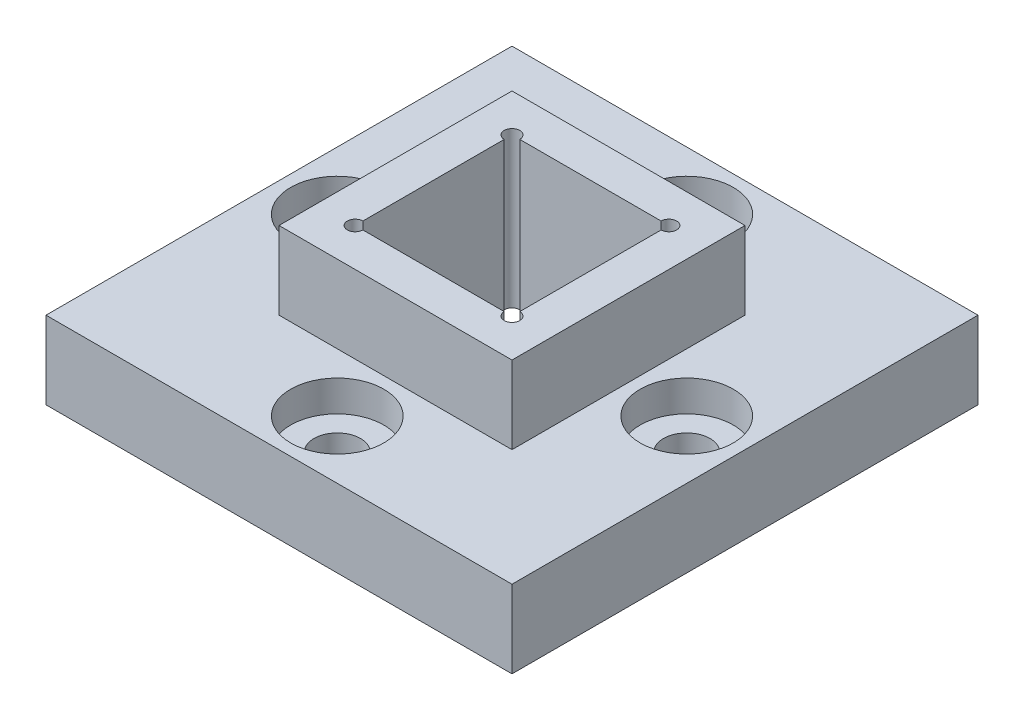
ISO-10303-21;
HEADER;
FILE_DESCRIPTION(('STEP AP214'),'2;1');
FILE_NAME('part.step','',(''),(''),'','','');
FILE_SCHEMA(('AUTOMOTIVE_DESIGN { 1 0 10303 214 1 1 1 1 }'));
ENDSEC;
DATA;
#1=APPLICATION_CONTEXT('core data for automotive mechanical design processes');
#2=APPLICATION_PROTOCOL_DEFINITION('international standard','automotive_design',2000,#1);
#3=PRODUCT_CONTEXT('',#1,'mechanical');
#4=PRODUCT('Part','Part','',(#3));
#5=PRODUCT_RELATED_PRODUCT_CATEGORY('part','',(#4));
#6=PRODUCT_DEFINITION_FORMATION('','',#4);
#7=PRODUCT_DEFINITION_CONTEXT('part definition',#1,'design');
#8=PRODUCT_DEFINITION('design','',#6,#7);
#9=PRODUCT_DEFINITION_SHAPE('','',#8);
#10=(LENGTH_UNIT() NAMED_UNIT(*) SI_UNIT(.MILLI.,.METRE.));
#11=(NAMED_UNIT(*) PLANE_ANGLE_UNIT() SI_UNIT($,.RADIAN.));
#12=(NAMED_UNIT(*) SI_UNIT($,.STERADIAN.) SOLID_ANGLE_UNIT());
#13=UNCERTAINTY_MEASURE_WITH_UNIT(LENGTH_MEASURE(1.E-05),#10,'distance_accuracy_value','');
#14=(GEOMETRIC_REPRESENTATION_CONTEXT(3) GLOBAL_UNCERTAINTY_ASSIGNED_CONTEXT((#13)) GLOBAL_UNIT_ASSIGNED_CONTEXT((#10,
#11,#12)) REPRESENTATION_CONTEXT('',''));
#15=CARTESIAN_POINT('',(0.,0.,0.));
#16=DIRECTION('',(0.,0.,1.));
#17=DIRECTION('',(1.,0.,0.));
#18=AXIS2_PLACEMENT_3D('',#15,#16,#17);
#19=CARTESIAN_POINT('',(11.25,0.,0.));
#20=DIRECTION('',(0.,1.,0.));
#21=DIRECTION('',(0.,0.,1.));
#22=AXIS2_PLACEMENT_3D('',#19,#20,#21);
#23=CYLINDRICAL_SURFACE('',#22,1.5);
#24=CARTESIAN_POINT('',(11.25,0.,0.));
#25=DIRECTION('',(0.,1.,0.));
#26=DIRECTION('',(0.,0.,1.));
#27=AXIS2_PLACEMENT_3D('',#24,#25,#26);
#28=CIRCLE('',#27,1.5);
#29=CARTESIAN_POINT('',(11.25,0.,1.5));
#30=VERTEX_POINT('',#29);
#31=EDGE_CURVE('E236',#30,#30,#28,.T.);
#32=ORIENTED_EDGE('',*,*,#31,.F.);
#33=EDGE_LOOP('',(#32));
#34=FACE_BOUND('',#33,.T.);
#35=CARTESIAN_POINT('',(11.25,3.,0.));
#36=DIRECTION('',(0.,1.,0.));
#37=DIRECTION('',(0.,0.,1.));
#38=AXIS2_PLACEMENT_3D('',#35,#36,#37);
#39=CIRCLE('',#38,1.5);
#40=CARTESIAN_POINT('',(11.25,3.,1.5));
#41=VERTEX_POINT('',#40);
#42=EDGE_CURVE('E93',#41,#41,#39,.F.);
#43=ORIENTED_EDGE('',*,*,#42,.F.);
#44=EDGE_LOOP('',(#43));
#45=FACE_BOUND('',#44,.T.);
#46=ADVANCED_FACE('F87',(#34,#45),#23,.F.);
#47=CARTESIAN_POINT('',(0.,0.,-11.25));
#48=DIRECTION('',(0.,1.,0.));
#49=DIRECTION('',(0.,0.,1.));
#50=AXIS2_PLACEMENT_3D('',#47,#48,#49);
#51=CYLINDRICAL_SURFACE('',#50,1.5);
#52=CARTESIAN_POINT('',(0.,0.,-11.25));
#53=DIRECTION('',(0.,1.,0.));
#54=DIRECTION('',(0.,0.,1.));
#55=AXIS2_PLACEMENT_3D('',#52,#53,#54);
#56=CIRCLE('',#55,1.5);
#57=CARTESIAN_POINT('',(0.,0.,-9.75));
#58=VERTEX_POINT('',#57);
#59=EDGE_CURVE('E241',#58,#58,#56,.T.);
#60=ORIENTED_EDGE('',*,*,#59,.F.);
#61=EDGE_LOOP('',(#60));
#62=FACE_BOUND('',#61,.T.);
#63=CARTESIAN_POINT('',(0.,3.,-11.25));
#64=DIRECTION('',(0.,1.,0.));
#65=DIRECTION('',(0.,0.,1.));
#66=AXIS2_PLACEMENT_3D('',#63,#64,#65);
#67=CIRCLE('',#66,1.5);
#68=CARTESIAN_POINT('',(0.,3.,-9.75));
#69=VERTEX_POINT('',#68);
#70=EDGE_CURVE('E336',#69,#69,#67,.F.);
#71=ORIENTED_EDGE('',*,*,#70,.F.);
#72=EDGE_LOOP('',(#71));
#73=FACE_BOUND('',#72,.T.);
#74=ADVANCED_FACE('F438',(#62,#73),#51,.F.);
#75=CARTESIAN_POINT('',(-11.25,0.,0.));
#76=DIRECTION('',(0.,1.,0.));
#77=DIRECTION('',(0.,0.,1.));
#78=AXIS2_PLACEMENT_3D('',#75,#76,#77);
#79=CYLINDRICAL_SURFACE('',#78,1.5);
#80=CARTESIAN_POINT('',(-11.25,0.,0.));
#81=DIRECTION('',(0.,1.,0.));
#82=DIRECTION('',(0.,0.,1.));
#83=AXIS2_PLACEMENT_3D('',#80,#81,#82);
#84=CIRCLE('',#83,1.5);
#85=CARTESIAN_POINT('',(-11.25,0.,1.5));
#86=VERTEX_POINT('',#85);
#87=EDGE_CURVE('E246',#86,#86,#84,.T.);
#88=ORIENTED_EDGE('',*,*,#87,.F.);
#89=EDGE_LOOP('',(#88));
#90=FACE_BOUND('',#89,.T.);
#91=CARTESIAN_POINT('',(-11.25,3.,0.));
#92=DIRECTION('',(0.,1.,0.));
#93=DIRECTION('',(0.,0.,1.));
#94=AXIS2_PLACEMENT_3D('',#91,#92,#93);
#95=CIRCLE('',#94,1.5);
#96=CARTESIAN_POINT('',(-11.25,3.,1.5));
#97=VERTEX_POINT('',#96);
#98=EDGE_CURVE('E331',#97,#97,#95,.F.);
#99=ORIENTED_EDGE('',*,*,#98,.F.);
#100=EDGE_LOOP('',(#99));
#101=FACE_BOUND('',#100,.T.);
#102=ADVANCED_FACE('F448',(#90,#101),#79,.F.);
#103=CARTESIAN_POINT('',(0.,0.,11.25));
#104=DIRECTION('',(0.,1.,0.));
#105=DIRECTION('',(0.,0.,1.));
#106=AXIS2_PLACEMENT_3D('',#103,#104,#105);
#107=CYLINDRICAL_SURFACE('',#106,1.5);
#108=CARTESIAN_POINT('',(0.,0.,11.25));
#109=DIRECTION('',(0.,1.,0.));
#110=DIRECTION('',(0.,0.,1.));
#111=AXIS2_PLACEMENT_3D('',#108,#109,#110);
#112=CIRCLE('',#111,1.5);
#113=CARTESIAN_POINT('',(0.,0.,12.75));
#114=VERTEX_POINT('',#113);
#115=EDGE_CURVE('E245',#114,#114,#112,.T.);
#116=ORIENTED_EDGE('',*,*,#115,.F.);
#117=EDGE_LOOP('',(#116));
#118=FACE_BOUND('',#117,.T.);
#119=CARTESIAN_POINT('',(0.,3.,11.25));
#120=DIRECTION('',(0.,1.,0.));
#121=DIRECTION('',(0.,0.,1.));
#122=AXIS2_PLACEMENT_3D('',#119,#120,#121);
#123=CIRCLE('',#122,1.5);
#124=CARTESIAN_POINT('',(0.,3.,12.75));
#125=VERTEX_POINT('',#124);
#126=EDGE_CURVE('E329',#125,#125,#123,.F.);
#127=ORIENTED_EDGE('',*,*,#126,.F.);
#128=EDGE_LOOP('',(#127));
#129=FACE_BOUND('',#128,.T.);
#130=ADVANCED_FACE('F495',(#118,#129),#107,.F.);
#131=CARTESIAN_POINT('',(15.,5.,-15.));
#132=DIRECTION('',(-1.,0.,0.));
#133=DIRECTION('',(0.,0.,1.));
#134=AXIS2_PLACEMENT_3D('',#131,#132,#133);
#135=PLANE('',#134);
#136=DIRECTION('',(0.,0.,-1.));
#137=VECTOR('',#136,1.);
#138=CARTESIAN_POINT('',(15.,0.,-15.));
#139=LINE('',#138,#137);
#140=CARTESIAN_POINT('',(15.,0.,15.));
#141=VERTEX_POINT('',#140);
#142=CARTESIAN_POINT('',(15.,0.,-15.));
#143=VERTEX_POINT('',#142);
#144=EDGE_CURVE('E291',#141,#143,#139,.T.);
#145=ORIENTED_EDGE('',*,*,#144,.T.);
#146=DIRECTION('',(0.,-1.,0.));
#147=VECTOR('',#146,1.);
#148=CARTESIAN_POINT('',(15.,5.,-15.));
#149=LINE('',#148,#147);
#150=CARTESIAN_POINT('',(15.,5.,-15.));
#151=VERTEX_POINT('',#150);
#152=EDGE_CURVE('E12',#151,#143,#149,.T.);
#153=ORIENTED_EDGE('',*,*,#152,.F.);
#154=DIRECTION('',(0.,0.,-1.));
#155=VECTOR('',#154,1.);
#156=CARTESIAN_POINT('',(15.,5.,-15.));
#157=LINE('',#156,#155);
#158=CARTESIAN_POINT('',(15.,5.,15.));
#159=VERTEX_POINT('',#158);
#160=EDGE_CURVE('E294',#159,#151,#157,.T.);
#161=ORIENTED_EDGE('',*,*,#160,.F.);
#162=DIRECTION('',(0.,-1.,0.));
#163=VECTOR('',#162,1.);
#164=CARTESIAN_POINT('',(15.,5.,15.));
#165=LINE('',#164,#163);
#166=EDGE_CURVE('E306',#159,#141,#165,.T.);
#167=ORIENTED_EDGE('',*,*,#166,.T.);
#168=EDGE_LOOP('',(#145,#153,#161,#167));
#169=FACE_BOUND('',#168,.T.);
#170=ADVANCED_FACE('F90',(#169),#135,.F.);
#171=CARTESIAN_POINT('',(-15.,5.,-15.));
#172=DIRECTION('',(0.,0.,1.));
#173=DIRECTION('',(1.,0.,0.));
#174=AXIS2_PLACEMENT_3D('',#171,#172,#173);
#175=PLANE('',#174);
#176=DIRECTION('',(-1.,0.,0.));
#177=VECTOR('',#176,1.);
#178=CARTESIAN_POINT('',(-15.,0.,-15.));
#179=LINE('',#178,#177);
#180=CARTESIAN_POINT('',(-15.,0.,-15.));
#181=VERTEX_POINT('',#180);
#182=EDGE_CURVE('E315',#143,#181,#179,.T.);
#183=ORIENTED_EDGE('',*,*,#182,.T.);
#184=DIRECTION('',(0.,-1.,0.));
#185=VECTOR('',#184,1.);
#186=CARTESIAN_POINT('',(-15.,5.,-15.));
#187=LINE('',#186,#185);
#188=CARTESIAN_POINT('',(-15.,5.,-15.));
#189=VERTEX_POINT('',#188);
#190=EDGE_CURVE('E100',#189,#181,#187,.T.);
#191=ORIENTED_EDGE('',*,*,#190,.F.);
#192=DIRECTION('',(-1.,0.,0.));
#193=VECTOR('',#192,1.);
#194=CARTESIAN_POINT('',(-15.,5.,-15.));
#195=LINE('',#194,#193);
#196=EDGE_CURVE('E296',#151,#189,#195,.T.);
#197=ORIENTED_EDGE('',*,*,#196,.F.);
#198=ORIENTED_EDGE('',*,*,#152,.T.);
#199=EDGE_LOOP('',(#183,#191,#197,#198));
#200=FACE_BOUND('',#199,.T.);
#201=ADVANCED_FACE('F484',(#200),#175,.F.);
#202=CARTESIAN_POINT('',(-15.,5.,-15.));
#203=DIRECTION('',(1.,0.,0.));
#204=DIRECTION('',(0.,0.,-1.));
#205=AXIS2_PLACEMENT_3D('',#202,#203,#204);
#206=PLANE('',#205);
#207=DIRECTION('',(0.,0.,1.));
#208=VECTOR('',#207,1.);
#209=CARTESIAN_POINT('',(-15.,0.,-15.));
#210=LINE('',#209,#208);
#211=CARTESIAN_POINT('',(-15.,0.,15.));
#212=VERTEX_POINT('',#211);
#213=EDGE_CURVE('E312',#181,#212,#210,.T.);
#214=ORIENTED_EDGE('',*,*,#213,.T.);
#215=DIRECTION('',(0.,-1.,0.));
#216=VECTOR('',#215,1.);
#217=CARTESIAN_POINT('',(-15.,5.,15.));
#218=LINE('',#217,#216);
#219=CARTESIAN_POINT('',(-15.,5.,15.));
#220=VERTEX_POINT('',#219);
#221=EDGE_CURVE('E323',#220,#212,#218,.T.);
#222=ORIENTED_EDGE('',*,*,#221,.F.);
#223=DIRECTION('',(0.,0.,1.));
#224=VECTOR('',#223,1.);
#225=CARTESIAN_POINT('',(-15.,5.,-15.));
#226=LINE('',#225,#224);
#227=EDGE_CURVE('E301',#189,#220,#226,.T.);
#228=ORIENTED_EDGE('',*,*,#227,.F.);
#229=ORIENTED_EDGE('',*,*,#190,.T.);
#230=EDGE_LOOP('',(#214,#222,#228,#229));
#231=FACE_BOUND('',#230,.T.);
#232=ADVANCED_FACE('F485',(#231),#206,.F.);
#233=CARTESIAN_POINT('',(-15.,5.,15.));
#234=DIRECTION('',(0.,0.,-1.));
#235=DIRECTION('',(-1.,0.,0.));
#236=AXIS2_PLACEMENT_3D('',#233,#234,#235);
#237=PLANE('',#236);
#238=DIRECTION('',(1.,0.,0.));
#239=VECTOR('',#238,1.);
#240=CARTESIAN_POINT('',(-15.,0.,15.));
#241=LINE('',#240,#239);
#242=EDGE_CURVE('E297',#212,#141,#241,.T.);
#243=ORIENTED_EDGE('',*,*,#242,.T.);
#244=ORIENTED_EDGE('',*,*,#166,.F.);
#245=DIRECTION('',(1.,0.,0.));
#246=VECTOR('',#245,1.);
#247=CARTESIAN_POINT('',(-15.,5.,15.));
#248=LINE('',#247,#246);
#249=EDGE_CURVE('E302',#220,#159,#248,.T.);
#250=ORIENTED_EDGE('',*,*,#249,.F.);
#251=ORIENTED_EDGE('',*,*,#221,.T.);
#252=EDGE_LOOP('',(#243,#244,#250,#251));
#253=FACE_BOUND('',#252,.T.);
#254=ADVANCED_FACE('F474',(#253),#237,.F.);
#255=CARTESIAN_POINT('',(0.,5.,0.));
#256=DIRECTION('',(0.,1.,0.));
#257=DIRECTION('',(0.,0.,1.));
#258=AXIS2_PLACEMENT_3D('',#255,#256,#257);
#259=PLANE('',#258);
#260=CARTESIAN_POINT('',(11.25,5.,0.));
#261=DIRECTION('',(0.,1.,0.));
#262=DIRECTION('',(0.,0.,1.));
#263=AXIS2_PLACEMENT_3D('',#260,#261,#262);
#264=CIRCLE('',#263,3.);
#265=CARTESIAN_POINT('',(11.25,5.,3.));
#266=VERTEX_POINT('',#265);
#267=EDGE_CURVE('E642',#266,#266,#264,.T.);
#268=ORIENTED_EDGE('',*,*,#267,.F.);
#269=EDGE_LOOP('',(#268));
#270=FACE_BOUND('',#269,.T.);
#271=CARTESIAN_POINT('',(0.,5.,11.25));
#272=DIRECTION('',(0.,1.,0.));
#273=DIRECTION('',(0.,0.,1.));
#274=AXIS2_PLACEMENT_3D('',#271,#272,#273);
#275=CIRCLE('',#274,3.);
#276=CARTESIAN_POINT('',(0.,5.,14.25));
#277=VERTEX_POINT('',#276);
#278=EDGE_CURVE('E650',#277,#277,#275,.T.);
#279=ORIENTED_EDGE('',*,*,#278,.F.);
#280=EDGE_LOOP('',(#279));
#281=FACE_BOUND('',#280,.T.);
#282=CARTESIAN_POINT('',(-11.25,5.,0.));
#283=DIRECTION('',(0.,1.,0.));
#284=DIRECTION('',(0.,0.,1.));
#285=AXIS2_PLACEMENT_3D('',#282,#283,#284);
#286=CIRCLE('',#285,3.);
#287=CARTESIAN_POINT('',(-11.25,5.,3.00000000000001));
#288=VERTEX_POINT('',#287);
#289=EDGE_CURVE('E658',#288,#288,#286,.T.);
#290=ORIENTED_EDGE('',*,*,#289,.F.);
#291=EDGE_LOOP('',(#290));
#292=FACE_BOUND('',#291,.T.);
#293=CARTESIAN_POINT('',(0.,5.,-11.25));
#294=DIRECTION('',(0.,1.,0.));
#295=DIRECTION('',(0.,0.,1.));
#296=AXIS2_PLACEMENT_3D('',#293,#294,#295);
#297=CIRCLE('',#296,3.);
#298=CARTESIAN_POINT('',(0.,5.,-8.25));
#299=VERTEX_POINT('',#298);
#300=EDGE_CURVE('E670',#299,#299,#297,.T.);
#301=ORIENTED_EDGE('',*,*,#300,.F.);
#302=EDGE_LOOP('',(#301));
#303=FACE_BOUND('',#302,.T.);
#304=DIRECTION('',(0.,0.,-1.));
#305=VECTOR('',#304,1.);
#306=CARTESIAN_POINT('',(7.5,5.,-7.5));
#307=LINE('',#306,#305);
#308=CARTESIAN_POINT('',(7.5,5.,7.5));
#309=VERTEX_POINT('',#308);
#310=CARTESIAN_POINT('',(7.5,5.,-7.5));
#311=VERTEX_POINT('',#310);
#312=EDGE_CURVE('E263',#309,#311,#307,.T.);
#313=ORIENTED_EDGE('',*,*,#312,.F.);
#314=DIRECTION('',(1.,0.,0.));
#315=VECTOR('',#314,1.);
#316=CARTESIAN_POINT('',(-7.5,5.,7.5));
#317=LINE('',#316,#315);
#318=CARTESIAN_POINT('',(-7.5,5.,7.5));
#319=VERTEX_POINT('',#318);
#320=EDGE_CURVE('E251',#319,#309,#317,.T.);
#321=ORIENTED_EDGE('',*,*,#320,.F.);
#322=DIRECTION('',(0.,0.,1.));
#323=VECTOR('',#322,1.);
#324=CARTESIAN_POINT('',(-7.5,5.,-7.5));
#325=LINE('',#324,#323);
#326=CARTESIAN_POINT('',(-7.5,5.,-7.5));
#327=VERTEX_POINT('',#326);
#328=EDGE_CURVE('E271',#327,#319,#325,.T.);
#329=ORIENTED_EDGE('',*,*,#328,.F.);
#330=DIRECTION('',(-1.,0.,0.));
#331=VECTOR('',#330,1.);
#332=CARTESIAN_POINT('',(-7.5,5.,-7.5));
#333=LINE('',#332,#331);
#334=EDGE_CURVE('E270',#311,#327,#333,.T.);
#335=ORIENTED_EDGE('',*,*,#334,.F.);
#336=EDGE_LOOP('',(#313,#321,#329,#335));
#337=FACE_BOUND('',#336,.T.);
#338=ORIENTED_EDGE('',*,*,#160,.T.);
#339=ORIENTED_EDGE('',*,*,#196,.T.);
#340=ORIENTED_EDGE('',*,*,#227,.T.);
#341=ORIENTED_EDGE('',*,*,#249,.T.);
#342=EDGE_LOOP('',(#338,#339,#340,#341));
#343=FACE_BOUND('',#342,.T.);
#344=ADVANCED_FACE('F472',(#270,#281,#292,#303,#337,#343),#259,.T.);
#345=CARTESIAN_POINT('',(0.,0.,0.));
#346=DIRECTION('',(0.,1.,0.));
#347=DIRECTION('',(0.,0.,1.));
#348=AXIS2_PLACEMENT_3D('',#345,#346,#347);
#349=PLANE('',#348);
#350=ORIENTED_EDGE('',*,*,#115,.T.);
#351=EDGE_LOOP('',(#350));
#352=FACE_BOUND('',#351,.T.);
#353=DIRECTION('',(1.,0.,0.));
#354=VECTOR('',#353,1.);
#355=CARTESIAN_POINT('',(0.,0.,-5.05));
#356=LINE('',#355,#354);
#357=CARTESIAN_POINT('',(-4.55,0.,-5.05));
#358=VERTEX_POINT('',#357);
#359=CARTESIAN_POINT('',(4.55,0.,-5.05));
#360=VERTEX_POINT('',#359);
#361=EDGE_CURVE('E404',#358,#360,#356,.T.);
#362=ORIENTED_EDGE('',*,*,#361,.F.);
#363=CARTESIAN_POINT('',(-5.05,0.,-5.05));
#364=DIRECTION('',(0.,1.,0.));
#365=DIRECTION('',(0.,0.,1.));
#366=AXIS2_PLACEMENT_3D('',#363,#364,#365);
#367=CIRCLE('',#366,0.5);
#368=CARTESIAN_POINT('',(-5.05,0.,-4.55));
#369=VERTEX_POINT('',#368);
#370=EDGE_CURVE('E364',#358,#369,#367,.T.);
#371=ORIENTED_EDGE('',*,*,#370,.T.);
#372=DIRECTION('',(0.,0.,1.));
#373=VECTOR('',#372,1.);
#374=CARTESIAN_POINT('',(-5.05,0.,0.));
#375=LINE('',#374,#373);
#376=CARTESIAN_POINT('',(-5.05,0.,4.55));
#377=VERTEX_POINT('',#376);
#378=EDGE_CURVE('E373',#369,#377,#375,.T.);
#379=ORIENTED_EDGE('',*,*,#378,.T.);
#380=CARTESIAN_POINT('',(-5.05,0.,5.05));
#381=DIRECTION('',(0.,1.,0.));
#382=DIRECTION('',(0.,0.,1.));
#383=AXIS2_PLACEMENT_3D('',#380,#381,#382);
#384=CIRCLE('',#383,0.5);
#385=CARTESIAN_POINT('',(-4.55,0.,5.05));
#386=VERTEX_POINT('',#385);
#387=EDGE_CURVE('E230',#377,#386,#384,.T.);
#388=ORIENTED_EDGE('',*,*,#387,.T.);
#389=DIRECTION('',(1.,0.,0.));
#390=VECTOR('',#389,1.);
#391=CARTESIAN_POINT('',(0.,0.,5.05));
#392=LINE('',#391,#390);
#393=CARTESIAN_POINT('',(4.55,0.,5.05));
#394=VERTEX_POINT('',#393);
#395=EDGE_CURVE('E202',#386,#394,#392,.T.);
#396=ORIENTED_EDGE('',*,*,#395,.T.);
#397=CARTESIAN_POINT('',(5.05,0.,5.05));
#398=DIRECTION('',(0.,1.,0.));
#399=DIRECTION('',(0.,0.,1.));
#400=AXIS2_PLACEMENT_3D('',#397,#398,#399);
#401=CIRCLE('',#400,0.5);
#402=CARTESIAN_POINT('',(5.05,0.,4.55));
#403=VERTEX_POINT('',#402);
#404=EDGE_CURVE('E214',#394,#403,#401,.T.);
#405=ORIENTED_EDGE('',*,*,#404,.T.);
#406=DIRECTION('',(0.,0.,1.));
#407=VECTOR('',#406,1.);
#408=CARTESIAN_POINT('',(5.05,0.,0.));
#409=LINE('',#408,#407);
#410=CARTESIAN_POINT('',(5.05,0.,-4.55));
#411=VERTEX_POINT('',#410);
#412=EDGE_CURVE('E104',#411,#403,#409,.T.);
#413=ORIENTED_EDGE('',*,*,#412,.F.);
#414=CARTESIAN_POINT('',(5.05,0.,-5.05));
#415=DIRECTION('',(0.,1.,0.));
#416=DIRECTION('',(0.,0.,1.));
#417=AXIS2_PLACEMENT_3D('',#414,#415,#416);
#418=CIRCLE('',#417,0.5);
#419=EDGE_CURVE('E233',#411,#360,#418,.T.);
#420=ORIENTED_EDGE('',*,*,#419,.T.);
#421=EDGE_LOOP('',(#362,#371,#379,#388,#396,#405,#413,#420));
#422=FACE_BOUND('',#421,.T.);
#423=ORIENTED_EDGE('',*,*,#87,.T.);
#424=EDGE_LOOP('',(#423));
#425=FACE_BOUND('',#424,.T.);
#426=ORIENTED_EDGE('',*,*,#59,.T.);
#427=EDGE_LOOP('',(#426));
#428=FACE_BOUND('',#427,.T.);
#429=ORIENTED_EDGE('',*,*,#31,.T.);
#430=EDGE_LOOP('',(#429));
#431=FACE_BOUND('',#430,.T.);
#432=ORIENTED_EDGE('',*,*,#144,.F.);
#433=ORIENTED_EDGE('',*,*,#242,.F.);
#434=ORIENTED_EDGE('',*,*,#213,.F.);
#435=ORIENTED_EDGE('',*,*,#182,.F.);
#436=EDGE_LOOP('',(#432,#433,#434,#435));
#437=FACE_BOUND('',#436,.T.);
#438=ADVANCED_FACE('F224',(#352,#422,#425,#428,#431,#437),#349,.F.);
#439=CARTESIAN_POINT('',(7.5,10.,-7.5));
#440=DIRECTION('',(-1.,0.,0.));
#441=DIRECTION('',(0.,0.,1.));
#442=AXIS2_PLACEMENT_3D('',#439,#440,#441);
#443=PLANE('',#442);
#444=ORIENTED_EDGE('',*,*,#312,.T.);
#445=DIRECTION('',(0.,-1.,0.));
#446=VECTOR('',#445,1.);
#447=CARTESIAN_POINT('',(7.5,10.,-7.5));
#448=LINE('',#447,#446);
#449=CARTESIAN_POINT('',(7.5,10.,-7.5));
#450=VERTEX_POINT('',#449);
#451=EDGE_CURVE('E288',#450,#311,#448,.T.);
#452=ORIENTED_EDGE('',*,*,#451,.F.);
#453=DIRECTION('',(0.,0.,-1.));
#454=VECTOR('',#453,1.);
#455=CARTESIAN_POINT('',(7.5,10.,-7.5));
#456=LINE('',#455,#454);
#457=CARTESIAN_POINT('',(7.5,10.,7.5));
#458=VERTEX_POINT('',#457);
#459=EDGE_CURVE('E250',#458,#450,#456,.T.);
#460=ORIENTED_EDGE('',*,*,#459,.F.);
#461=DIRECTION('',(0.,-1.,0.));
#462=VECTOR('',#461,1.);
#463=CARTESIAN_POINT('',(7.5,10.,7.5));
#464=LINE('',#463,#462);
#465=EDGE_CURVE('E265',#458,#309,#464,.T.);
#466=ORIENTED_EDGE('',*,*,#465,.T.);
#467=EDGE_LOOP('',(#444,#452,#460,#466));
#468=FACE_BOUND('',#467,.T.);
#469=ADVANCED_FACE('F466',(#468),#443,.F.);
#470=CARTESIAN_POINT('',(-7.5,10.,-7.5));
#471=DIRECTION('',(0.,0.,1.));
#472=DIRECTION('',(1.,0.,0.));
#473=AXIS2_PLACEMENT_3D('',#470,#471,#472);
#474=PLANE('',#473);
#475=ORIENTED_EDGE('',*,*,#334,.T.);
#476=DIRECTION('',(0.,-1.,0.));
#477=VECTOR('',#476,1.);
#478=CARTESIAN_POINT('',(-7.5,10.,-7.5));
#479=LINE('',#478,#477);
#480=CARTESIAN_POINT('',(-7.5,10.,-7.5));
#481=VERTEX_POINT('',#480);
#482=EDGE_CURVE('E284',#481,#327,#479,.T.);
#483=ORIENTED_EDGE('',*,*,#482,.F.);
#484=DIRECTION('',(-1.,0.,0.));
#485=VECTOR('',#484,1.);
#486=CARTESIAN_POINT('',(-7.5,10.,-7.5));
#487=LINE('',#486,#485);
#488=EDGE_CURVE('E252',#450,#481,#487,.T.);
#489=ORIENTED_EDGE('',*,*,#488,.F.);
#490=ORIENTED_EDGE('',*,*,#451,.T.);
#491=EDGE_LOOP('',(#475,#483,#489,#490));
#492=FACE_BOUND('',#491,.T.);
#493=ADVANCED_FACE('F461',(#492),#474,.F.);
#494=CARTESIAN_POINT('',(-7.5,10.,-7.5));
#495=DIRECTION('',(1.,0.,0.));
#496=DIRECTION('',(0.,0.,-1.));
#497=AXIS2_PLACEMENT_3D('',#494,#495,#496);
#498=PLANE('',#497);
#499=ORIENTED_EDGE('',*,*,#328,.T.);
#500=DIRECTION('',(0.,-1.,0.));
#501=VECTOR('',#500,1.);
#502=CARTESIAN_POINT('',(-7.5,10.,7.5));
#503=LINE('',#502,#501);
#504=CARTESIAN_POINT('',(-7.5,10.,7.5));
#505=VERTEX_POINT('',#504);
#506=EDGE_CURVE('E283',#505,#319,#503,.T.);
#507=ORIENTED_EDGE('',*,*,#506,.F.);
#508=DIRECTION('',(0.,0.,1.));
#509=VECTOR('',#508,1.);
#510=CARTESIAN_POINT('',(-7.5,10.,-7.5));
#511=LINE('',#510,#509);
#512=EDGE_CURVE('E258',#481,#505,#511,.T.);
#513=ORIENTED_EDGE('',*,*,#512,.F.);
#514=ORIENTED_EDGE('',*,*,#482,.T.);
#515=EDGE_LOOP('',(#499,#507,#513,#514));
#516=FACE_BOUND('',#515,.T.);
#517=ADVANCED_FACE('F459',(#516),#498,.F.);
#518=CARTESIAN_POINT('',(-7.5,10.,7.5));
#519=DIRECTION('',(0.,0.,-1.));
#520=DIRECTION('',(-1.,0.,0.));
#521=AXIS2_PLACEMENT_3D('',#518,#519,#520);
#522=PLANE('',#521);
#523=ORIENTED_EDGE('',*,*,#320,.T.);
#524=ORIENTED_EDGE('',*,*,#465,.F.);
#525=DIRECTION('',(1.,0.,0.));
#526=VECTOR('',#525,1.);
#527=CARTESIAN_POINT('',(-7.5,10.,7.5));
#528=LINE('',#527,#526);
#529=EDGE_CURVE('E259',#505,#458,#528,.T.);
#530=ORIENTED_EDGE('',*,*,#529,.F.);
#531=ORIENTED_EDGE('',*,*,#506,.T.);
#532=EDGE_LOOP('',(#523,#524,#530,#531));
#533=FACE_BOUND('',#532,.T.);
#534=ADVANCED_FACE('F457',(#533),#522,.F.);
#535=CARTESIAN_POINT('',(0.,10.,0.));
#536=DIRECTION('',(0.,1.,0.));
#537=DIRECTION('',(0.,0.,1.));
#538=AXIS2_PLACEMENT_3D('',#535,#536,#537);
#539=PLANE('',#538);
#540=CARTESIAN_POINT('',(-5.05,10.,5.05));
#541=DIRECTION('',(0.,1.,0.));
#542=DIRECTION('',(0.,0.,1.));
#543=AXIS2_PLACEMENT_3D('',#540,#541,#542);
#544=CIRCLE('',#543,0.5);
#545=CARTESIAN_POINT('',(-5.05,10.,4.55));
#546=VERTEX_POINT('',#545);
#547=CARTESIAN_POINT('',(-4.55,10.,5.05));
#548=VERTEX_POINT('',#547);
#549=EDGE_CURVE('E369',#546,#548,#544,.T.);
#550=ORIENTED_EDGE('',*,*,#549,.F.);
#551=DIRECTION('',(0.,0.,1.));
#552=VECTOR('',#551,1.);
#553=CARTESIAN_POINT('',(-5.05,10.,0.));
#554=LINE('',#553,#552);
#555=CARTESIAN_POINT('',(-5.05,10.,-4.55));
#556=VERTEX_POINT('',#555);
#557=EDGE_CURVE('E231',#556,#546,#554,.T.);
#558=ORIENTED_EDGE('',*,*,#557,.F.);
#559=CARTESIAN_POINT('',(-5.05,10.,-5.05));
#560=DIRECTION('',(0.,1.,0.));
#561=DIRECTION('',(0.,0.,1.));
#562=AXIS2_PLACEMENT_3D('',#559,#560,#561);
#563=CIRCLE('',#562,0.5);
#564=CARTESIAN_POINT('',(-4.55,10.,-5.05));
#565=VERTEX_POINT('',#564);
#566=EDGE_CURVE('E219',#565,#556,#563,.T.);
#567=ORIENTED_EDGE('',*,*,#566,.F.);
#568=DIRECTION('',(1.,0.,0.));
#569=VECTOR('',#568,1.);
#570=CARTESIAN_POINT('',(0.,10.,-5.05));
#571=LINE('',#570,#569);
#572=CARTESIAN_POINT('',(4.55,10.,-5.05));
#573=VERTEX_POINT('',#572);
#574=EDGE_CURVE('E384',#565,#573,#571,.T.);
#575=ORIENTED_EDGE('',*,*,#574,.T.);
#576=CARTESIAN_POINT('',(5.05,10.,-5.05));
#577=DIRECTION('',(0.,1.,0.));
#578=DIRECTION('',(0.,0.,1.));
#579=AXIS2_PLACEMENT_3D('',#576,#577,#578);
#580=CIRCLE('',#579,0.5);
#581=CARTESIAN_POINT('',(5.05,10.,-4.55));
#582=VERTEX_POINT('',#581);
#583=EDGE_CURVE('E386',#582,#573,#580,.T.);
#584=ORIENTED_EDGE('',*,*,#583,.F.);
#585=DIRECTION('',(0.,0.,1.));
#586=VECTOR('',#585,1.);
#587=CARTESIAN_POINT('',(5.05,10.,0.));
#588=LINE('',#587,#586);
#589=CARTESIAN_POINT('',(5.05,10.,4.55));
#590=VERTEX_POINT('',#589);
#591=EDGE_CURVE('E391',#582,#590,#588,.T.);
#592=ORIENTED_EDGE('',*,*,#591,.T.);
#593=CARTESIAN_POINT('',(5.05,10.,5.05));
#594=DIRECTION('',(0.,1.,0.));
#595=DIRECTION('',(0.,0.,1.));
#596=AXIS2_PLACEMENT_3D('',#593,#594,#595);
#597=CIRCLE('',#596,0.5);
#598=CARTESIAN_POINT('',(4.55,10.,5.05));
#599=VERTEX_POINT('',#598);
#600=EDGE_CURVE('E218',#599,#590,#597,.T.);
#601=ORIENTED_EDGE('',*,*,#600,.F.);
#602=DIRECTION('',(1.,0.,0.));
#603=VECTOR('',#602,1.);
#604=CARTESIAN_POINT('',(0.,10.,5.05));
#605=LINE('',#604,#603);
#606=EDGE_CURVE('E114',#548,#599,#605,.T.);
#607=ORIENTED_EDGE('',*,*,#606,.F.);
#608=EDGE_LOOP('',(#550,#558,#567,#575,#584,#592,#601,#607));
#609=FACE_BOUND('',#608,.T.);
#610=ORIENTED_EDGE('',*,*,#459,.T.);
#611=ORIENTED_EDGE('',*,*,#488,.T.);
#612=ORIENTED_EDGE('',*,*,#512,.T.);
#613=ORIENTED_EDGE('',*,*,#529,.T.);
#614=EDGE_LOOP('',(#610,#611,#612,#613));
#615=FACE_BOUND('',#614,.T.);
#616=ADVANCED_FACE('F430',(#609,#615),#539,.T.);
#617=CARTESIAN_POINT('',(0.,0.,-5.05));
#618=DIRECTION('',(0.,0.,1.));
#619=DIRECTION('',(1.,0.,0.));
#620=AXIS2_PLACEMENT_3D('',#617,#618,#619);
#621=PLANE('',#620);
#622=ORIENTED_EDGE('',*,*,#361,.T.);
#623=DIRECTION('',(0.,1.,0.));
#624=VECTOR('',#623,1.);
#625=CARTESIAN_POINT('',(4.55,0.,-5.05));
#626=LINE('',#625,#624);
#627=EDGE_CURVE('E380',#360,#573,#626,.T.);
#628=ORIENTED_EDGE('',*,*,#627,.T.);
#629=ORIENTED_EDGE('',*,*,#574,.F.);
#630=DIRECTION('',(0.,1.,0.));
#631=VECTOR('',#630,1.);
#632=CARTESIAN_POINT('',(-4.55,0.,-5.05));
#633=LINE('',#632,#631);
#634=EDGE_CURVE('E349',#358,#565,#633,.T.);
#635=ORIENTED_EDGE('',*,*,#634,.F.);
#636=EDGE_LOOP('',(#622,#628,#629,#635));
#637=FACE_BOUND('',#636,.T.);
#638=ADVANCED_FACE('F418',(#637),#621,.T.);
#639=CARTESIAN_POINT('',(5.05,0.,-5.05));
#640=DIRECTION('',(0.,1.,0.));
#641=DIRECTION('',(0.,0.,1.));
#642=AXIS2_PLACEMENT_3D('',#639,#640,#641);
#643=CYLINDRICAL_SURFACE('',#642,0.5);
#644=ORIENTED_EDGE('',*,*,#583,.T.);
#645=ORIENTED_EDGE('',*,*,#627,.F.);
#646=ORIENTED_EDGE('',*,*,#419,.F.);
#647=DIRECTION('',(0.,1.,0.));
#648=VECTOR('',#647,1.);
#649=CARTESIAN_POINT('',(5.05,0.,-4.55));
#650=LINE('',#649,#648);
#651=EDGE_CURVE('E372',#411,#582,#650,.T.);
#652=ORIENTED_EDGE('',*,*,#651,.T.);
#653=EDGE_LOOP('',(#644,#645,#646,#652));
#654=FACE_BOUND('',#653,.T.);
#655=ADVANCED_FACE('F414',(#654),#643,.F.);
#656=CARTESIAN_POINT('',(5.05,0.,0.));
#657=DIRECTION('',(-1.,0.,0.));
#658=DIRECTION('',(0.,0.,1.));
#659=AXIS2_PLACEMENT_3D('',#656,#657,#658);
#660=PLANE('',#659);
#661=ORIENTED_EDGE('',*,*,#591,.F.);
#662=ORIENTED_EDGE('',*,*,#651,.F.);
#663=ORIENTED_EDGE('',*,*,#412,.T.);
#664=DIRECTION('',(0.,1.,0.));
#665=VECTOR('',#664,1.);
#666=CARTESIAN_POINT('',(5.05,0.,4.55));
#667=LINE('',#666,#665);
#668=EDGE_CURVE('E215',#590,#403,#667,.F.);
#669=ORIENTED_EDGE('',*,*,#668,.F.);
#670=EDGE_LOOP('',(#661,#662,#663,#669));
#671=FACE_BOUND('',#670,.T.);
#672=ADVANCED_FACE('F427',(#671),#660,.T.);
#673=CARTESIAN_POINT('',(0.,0.,5.05));
#674=DIRECTION('',(0.,0.,1.));
#675=DIRECTION('',(1.,0.,0.));
#676=AXIS2_PLACEMENT_3D('',#673,#674,#675);
#677=PLANE('',#676);
#678=DIRECTION('',(0.,1.,0.));
#679=VECTOR('',#678,1.);
#680=CARTESIAN_POINT('',(4.55,0.,5.05));
#681=LINE('',#680,#679);
#682=EDGE_CURVE('E203',#599,#394,#681,.F.);
#683=ORIENTED_EDGE('',*,*,#682,.T.);
#684=ORIENTED_EDGE('',*,*,#395,.F.);
#685=DIRECTION('',(0.,1.,0.));
#686=VECTOR('',#685,1.);
#687=CARTESIAN_POINT('',(-4.55,0.,5.05));
#688=LINE('',#687,#686);
#689=EDGE_CURVE('E367',#386,#548,#688,.T.);
#690=ORIENTED_EDGE('',*,*,#689,.T.);
#691=ORIENTED_EDGE('',*,*,#606,.T.);
#692=EDGE_LOOP('',(#683,#684,#690,#691));
#693=FACE_BOUND('',#692,.T.);
#694=ADVANCED_FACE('F201',(#693),#677,.F.);
#695=CARTESIAN_POINT('',(-5.05,0.,5.05));
#696=DIRECTION('',(0.,1.,0.));
#697=DIRECTION('',(0.,0.,1.));
#698=AXIS2_PLACEMENT_3D('',#695,#696,#697);
#699=CYLINDRICAL_SURFACE('',#698,0.5);
#700=ORIENTED_EDGE('',*,*,#549,.T.);
#701=ORIENTED_EDGE('',*,*,#689,.F.);
#702=ORIENTED_EDGE('',*,*,#387,.F.);
#703=DIRECTION('',(0.,1.,0.));
#704=VECTOR('',#703,1.);
#705=CARTESIAN_POINT('',(-5.05,0.,4.55));
#706=LINE('',#705,#704);
#707=EDGE_CURVE('E211',#377,#546,#706,.T.);
#708=ORIENTED_EDGE('',*,*,#707,.T.);
#709=EDGE_LOOP('',(#700,#701,#702,#708));
#710=FACE_BOUND('',#709,.T.);
#711=ADVANCED_FACE('F422',(#710),#699,.F.);
#712=CARTESIAN_POINT('',(-5.05,0.,0.));
#713=DIRECTION('',(-1.,0.,0.));
#714=DIRECTION('',(0.,0.,1.));
#715=AXIS2_PLACEMENT_3D('',#712,#713,#714);
#716=PLANE('',#715);
#717=DIRECTION('',(0.,1.,0.));
#718=VECTOR('',#717,1.);
#719=CARTESIAN_POINT('',(-5.05,0.,-4.55));
#720=LINE('',#719,#718);
#721=EDGE_CURVE('E342',#369,#556,#720,.T.);
#722=ORIENTED_EDGE('',*,*,#721,.T.);
#723=ORIENTED_EDGE('',*,*,#557,.T.);
#724=ORIENTED_EDGE('',*,*,#707,.F.);
#725=ORIENTED_EDGE('',*,*,#378,.F.);
#726=EDGE_LOOP('',(#722,#723,#724,#725));
#727=FACE_BOUND('',#726,.T.);
#728=ADVANCED_FACE('F423',(#727),#716,.F.);
#729=CARTESIAN_POINT('',(-5.05,0.,-5.05));
#730=DIRECTION('',(0.,1.,0.));
#731=DIRECTION('',(0.,0.,1.));
#732=AXIS2_PLACEMENT_3D('',#729,#730,#731);
#733=CYLINDRICAL_SURFACE('',#732,0.5);
#734=ORIENTED_EDGE('',*,*,#370,.F.);
#735=ORIENTED_EDGE('',*,*,#634,.T.);
#736=ORIENTED_EDGE('',*,*,#566,.T.);
#737=ORIENTED_EDGE('',*,*,#721,.F.);
#738=EDGE_LOOP('',(#734,#735,#736,#737));
#739=FACE_BOUND('',#738,.T.);
#740=ADVANCED_FACE('F419',(#739),#733,.F.);
#741=CARTESIAN_POINT('',(5.05,0.,5.05));
#742=DIRECTION('',(0.,1.,0.));
#743=DIRECTION('',(0.,0.,1.));
#744=AXIS2_PLACEMENT_3D('',#741,#742,#743);
#745=CYLINDRICAL_SURFACE('',#744,0.5);
#746=ORIENTED_EDGE('',*,*,#668,.T.);
#747=ORIENTED_EDGE('',*,*,#404,.F.);
#748=ORIENTED_EDGE('',*,*,#682,.F.);
#749=ORIENTED_EDGE('',*,*,#600,.T.);
#750=EDGE_LOOP('',(#746,#747,#748,#749));
#751=FACE_BOUND('',#750,.T.);
#752=ADVANCED_FACE('F216',(#751),#745,.F.);
#753=CARTESIAN_POINT('',(0.,3.,11.25));
#754=DIRECTION('',(0.,1.,0.));
#755=DIRECTION('',(0.,0.,1.));
#756=AXIS2_PLACEMENT_3D('',#753,#754,#755);
#757=PLANE('',#756);
#758=CARTESIAN_POINT('',(0.,3.,11.25));
#759=DIRECTION('',(0.,1.,0.));
#760=DIRECTION('',(0.,0.,1.));
#761=AXIS2_PLACEMENT_3D('',#758,#759,#760);
#762=CIRCLE('',#761,3.);
#763=CARTESIAN_POINT('',(0.,3.,14.25));
#764=VERTEX_POINT('',#763);
#765=EDGE_CURVE('E653',#764,#764,#762,.T.);
#766=ORIENTED_EDGE('',*,*,#765,.T.);
#767=EDGE_LOOP('',(#766));
#768=FACE_BOUND('',#767,.T.);
#769=ORIENTED_EDGE('',*,*,#126,.T.);
#770=EDGE_LOOP('',(#769));
#771=FACE_BOUND('',#770,.T.);
#772=ADVANCED_FACE('F525',(#768,#771),#757,.T.);
#773=CARTESIAN_POINT('',(0.,3.,11.25));
#774=DIRECTION('',(0.,1.,0.));
#775=DIRECTION('',(0.,0.,1.));
#776=AXIS2_PLACEMENT_3D('',#773,#774,#775);
#777=CYLINDRICAL_SURFACE('',#776,3.);
#778=ORIENTED_EDGE('',*,*,#765,.F.);
#779=EDGE_LOOP('',(#778));
#780=FACE_BOUND('',#779,.T.);
#781=ORIENTED_EDGE('',*,*,#278,.T.);
#782=EDGE_LOOP('',(#781));
#783=FACE_BOUND('',#782,.T.);
#784=ADVANCED_FACE('F568',(#780,#783),#777,.F.);
#785=CARTESIAN_POINT('',(-11.25,3.,0.));
#786=DIRECTION('',(0.,1.,0.));
#787=DIRECTION('',(0.,0.,1.));
#788=AXIS2_PLACEMENT_3D('',#785,#786,#787);
#789=PLANE('',#788);
#790=CARTESIAN_POINT('',(-11.25,3.,0.));
#791=DIRECTION('',(0.,1.,0.));
#792=DIRECTION('',(0.,0.,1.));
#793=AXIS2_PLACEMENT_3D('',#790,#791,#792);
#794=CIRCLE('',#793,3.);
#795=CARTESIAN_POINT('',(-11.25,3.,3.00000000000001));
#796=VERTEX_POINT('',#795);
#797=EDGE_CURVE('E664',#796,#796,#794,.T.);
#798=ORIENTED_EDGE('',*,*,#797,.T.);
#799=EDGE_LOOP('',(#798));
#800=FACE_BOUND('',#799,.T.);
#801=ORIENTED_EDGE('',*,*,#98,.T.);
#802=EDGE_LOOP('',(#801));
#803=FACE_BOUND('',#802,.T.);
#804=ADVANCED_FACE('F577',(#800,#803),#789,.T.);
#805=CARTESIAN_POINT('',(-11.25,3.,0.));
#806=DIRECTION('',(0.,1.,0.));
#807=DIRECTION('',(0.,0.,1.));
#808=AXIS2_PLACEMENT_3D('',#805,#806,#807);
#809=CYLINDRICAL_SURFACE('',#808,3.);
#810=ORIENTED_EDGE('',*,*,#797,.F.);
#811=EDGE_LOOP('',(#810));
#812=FACE_BOUND('',#811,.T.);
#813=ORIENTED_EDGE('',*,*,#289,.T.);
#814=EDGE_LOOP('',(#813));
#815=FACE_BOUND('',#814,.T.);
#816=ADVANCED_FACE('F587',(#812,#815),#809,.F.);
#817=CARTESIAN_POINT('',(0.,3.,-11.25));
#818=DIRECTION('',(0.,1.,0.));
#819=DIRECTION('',(0.,0.,1.));
#820=AXIS2_PLACEMENT_3D('',#817,#818,#819);
#821=PLANE('',#820);
#822=CARTESIAN_POINT('',(0.,3.,-11.25));
#823=DIRECTION('',(0.,1.,0.));
#824=DIRECTION('',(0.,0.,1.));
#825=AXIS2_PLACEMENT_3D('',#822,#823,#824);
#826=CIRCLE('',#825,3.);
#827=CARTESIAN_POINT('',(0.,3.,-8.25));
#828=VERTEX_POINT('',#827);
#829=EDGE_CURVE('E674',#828,#828,#826,.T.);
#830=ORIENTED_EDGE('',*,*,#829,.T.);
#831=EDGE_LOOP('',(#830));
#832=FACE_BOUND('',#831,.T.);
#833=ORIENTED_EDGE('',*,*,#70,.T.);
#834=EDGE_LOOP('',(#833));
#835=FACE_BOUND('',#834,.T.);
#836=ADVANCED_FACE('F517',(#832,#835),#821,.T.);
#837=CARTESIAN_POINT('',(0.,3.,-11.25));
#838=DIRECTION('',(0.,1.,0.));
#839=DIRECTION('',(0.,0.,1.));
#840=AXIS2_PLACEMENT_3D('',#837,#838,#839);
#841=CYLINDRICAL_SURFACE('',#840,3.);
#842=ORIENTED_EDGE('',*,*,#829,.F.);
#843=EDGE_LOOP('',(#842));
#844=FACE_BOUND('',#843,.T.);
#845=ORIENTED_EDGE('',*,*,#300,.T.);
#846=EDGE_LOOP('',(#845));
#847=FACE_BOUND('',#846,.T.);
#848=ADVANCED_FACE('F606',(#844,#847),#841,.F.);
#849=CARTESIAN_POINT('',(11.25,3.,0.));
#850=DIRECTION('',(0.,1.,0.));
#851=DIRECTION('',(0.,0.,1.));
#852=AXIS2_PLACEMENT_3D('',#849,#850,#851);
#853=PLANE('',#852);
#854=CARTESIAN_POINT('',(11.25,3.,0.));
#855=DIRECTION('',(0.,1.,0.));
#856=DIRECTION('',(0.,0.,1.));
#857=AXIS2_PLACEMENT_3D('',#854,#855,#856);
#858=CIRCLE('',#857,3.);
#859=CARTESIAN_POINT('',(11.25,3.,3.));
#860=VERTEX_POINT('',#859);
#861=EDGE_CURVE('E333',#860,#860,#858,.T.);
#862=ORIENTED_EDGE('',*,*,#861,.T.);
#863=EDGE_LOOP('',(#862));
#864=FACE_BOUND('',#863,.T.);
#865=ORIENTED_EDGE('',*,*,#42,.T.);
#866=EDGE_LOOP('',(#865));
#867=FACE_BOUND('',#866,.T.);
#868=ADVANCED_FACE('F620',(#864,#867),#853,.T.);
#869=CARTESIAN_POINT('',(11.25,3.,0.));
#870=DIRECTION('',(0.,1.,0.));
#871=DIRECTION('',(0.,0.,1.));
#872=AXIS2_PLACEMENT_3D('',#869,#870,#871);
#873=CYLINDRICAL_SURFACE('',#872,3.);
#874=ORIENTED_EDGE('',*,*,#861,.F.);
#875=EDGE_LOOP('',(#874));
#876=FACE_BOUND('',#875,.T.);
#877=ORIENTED_EDGE('',*,*,#267,.T.);
#878=EDGE_LOOP('',(#877));
#879=FACE_BOUND('',#878,.T.);
#880=ADVANCED_FACE('F630',(#876,#879),#873,.F.);
#881=CLOSED_SHELL('',(#46,#74,#102,#130,#170,#201,#232,#254,#344,#438,#469,#493,#517,#534,#616,
#638,#655,#672,#694,#711,#728,#740,#752,#772,#784,#804,#816,#836,#848,#868,#880));
#882=MANIFOLD_SOLID_BREP('B2',#881);
#883=ADVANCED_BREP_SHAPE_REPRESENTATION('',(#18,#882),#14);
#884=SHAPE_DEFINITION_REPRESENTATION(#9,#883);
ENDSEC;
END-ISO-10303-21;
